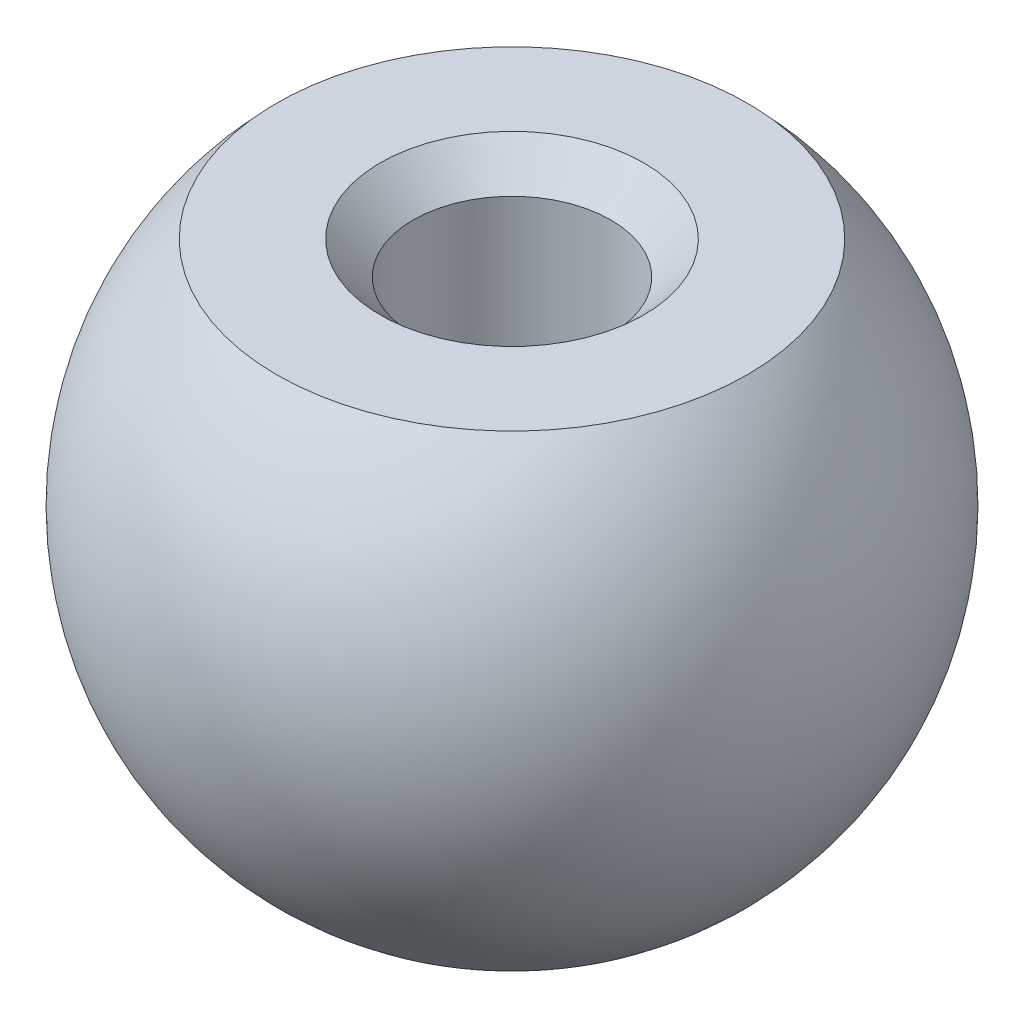
ISO-10303-21;
HEADER;
FILE_DESCRIPTION(('STEP AP214'),'2;1');
FILE_NAME('part.step','',(''),(''),'','','');
FILE_SCHEMA(('AUTOMOTIVE_DESIGN { 1 0 10303 214 1 1 1 1 }'));
ENDSEC;
DATA;
#1=APPLICATION_CONTEXT('core data for automotive mechanical design processes');
#2=APPLICATION_PROTOCOL_DEFINITION('international standard','automotive_design',2000,#1);
#3=PRODUCT_CONTEXT('',#1,'mechanical');
#4=PRODUCT('Part','Part','',(#3));
#5=PRODUCT_RELATED_PRODUCT_CATEGORY('part','',(#4));
#6=PRODUCT_DEFINITION_FORMATION('','',#4);
#7=PRODUCT_DEFINITION_CONTEXT('part definition',#1,'design');
#8=PRODUCT_DEFINITION('design','',#6,#7);
#9=PRODUCT_DEFINITION_SHAPE('','',#8);
#10=(LENGTH_UNIT() NAMED_UNIT(*) SI_UNIT(.MILLI.,.METRE.));
#11=(NAMED_UNIT(*) PLANE_ANGLE_UNIT() SI_UNIT($,.RADIAN.));
#12=(NAMED_UNIT(*) SI_UNIT($,.STERADIAN.) SOLID_ANGLE_UNIT());
#13=UNCERTAINTY_MEASURE_WITH_UNIT(LENGTH_MEASURE(1.E-05),#10,'distance_accuracy_value','');
#14=(GEOMETRIC_REPRESENTATION_CONTEXT(3) GLOBAL_UNCERTAINTY_ASSIGNED_CONTEXT((#13)) GLOBAL_UNIT_ASSIGNED_CONTEXT((#10,
#11,#12)) REPRESENTATION_CONTEXT('',''));
#15=CARTESIAN_POINT('',(0.,0.,0.));
#16=DIRECTION('',(0.,0.,1.));
#17=DIRECTION('',(1.,0.,0.));
#18=AXIS2_PLACEMENT_3D('',#15,#16,#17);
#19=CARTESIAN_POINT('',(0.,0.,0.));
#20=DIRECTION('',(0.,1.,0.));
#21=DIRECTION('',(1.,0.,0.));
#22=AXIS2_PLACEMENT_3D('',#19,#20,#21);
#23=SPHERICAL_SURFACE('',#22,5.);
#24=CARTESIAN_POINT('',(0.,3.5,0.));
#25=DIRECTION('',(0.,1.,0.));
#26=DIRECTION('',(0.,0.,1.));
#27=AXIS2_PLACEMENT_3D('',#24,#25,#26);
#28=CIRCLE('',#27,3.57071421427142);
#29=CARTESIAN_POINT('',(0.,3.5,3.57071421427142));
#30=VERTEX_POINT('',#29);
#31=EDGE_CURVE('E42',#30,#30,#28,.T.);
#32=ORIENTED_EDGE('',*,*,#31,.F.);
#33=EDGE_LOOP('',(#32));
#34=FACE_BOUND('',#33,.T.);
#35=ADVANCED_FACE('F31',(#34),#23,.T.);
#36=CARTESIAN_POINT('',(0.,3.5,0.));
#37=DIRECTION('',(0.,-1.,0.));
#38=DIRECTION('',(0.,0.,-1.));
#39=AXIS2_PLACEMENT_3D('',#36,#37,#38);
#40=PLANE('',#39);
#41=CARTESIAN_POINT('',(0.,3.5,0.));
#42=DIRECTION('',(0.,-1.,0.));
#43=DIRECTION('',(0.,0.,-1.));
#44=AXIS2_PLACEMENT_3D('',#41,#42,#43);
#45=CIRCLE('',#44,2.);
#46=CARTESIAN_POINT('',(0.,3.5,-2.));
#47=VERTEX_POINT('',#46);
#48=EDGE_CURVE('E10',#47,#47,#45,.T.);
#49=ORIENTED_EDGE('',*,*,#48,.T.);
#50=EDGE_LOOP('',(#49));
#51=FACE_BOUND('',#50,.T.);
#52=ORIENTED_EDGE('',*,*,#31,.T.);
#53=EDGE_LOOP('',(#52));
#54=FACE_BOUND('',#53,.T.);
#55=ADVANCED_FACE('F56',(#51,#54),#40,.F.);
#56=CARTESIAN_POINT('',(0.,-2.5,0.));
#57=DIRECTION('',(0.,1.,0.));
#58=DIRECTION('',(0.,0.,1.));
#59=AXIS2_PLACEMENT_3D('',#56,#57,#58);
#60=CYLINDRICAL_SURFACE('',#59,1.5);
#61=CARTESIAN_POINT('',(0.,3.,0.));
#62=DIRECTION('',(0.,-1.,0.));
#63=DIRECTION('',(0.,0.,-1.));
#64=AXIS2_PLACEMENT_3D('',#61,#62,#63);
#65=CIRCLE('',#64,1.5);
#66=CARTESIAN_POINT('',(0.,3.,-1.5));
#67=VERTEX_POINT('',#66);
#68=EDGE_CURVE('E38',#67,#67,#65,.F.);
#69=ORIENTED_EDGE('',*,*,#68,.T.);
#70=EDGE_LOOP('',(#69));
#71=FACE_BOUND('',#70,.T.);
#72=CARTESIAN_POINT('',(0.,-2.5,0.));
#73=DIRECTION('',(0.,1.,0.));
#74=DIRECTION('',(0.,0.,1.));
#75=AXIS2_PLACEMENT_3D('',#72,#73,#74);
#76=CIRCLE('',#75,1.5);
#77=CARTESIAN_POINT('',(0.,-2.5,1.5));
#78=VERTEX_POINT('',#77);
#79=EDGE_CURVE('E46',#78,#78,#76,.T.);
#80=ORIENTED_EDGE('',*,*,#79,.F.);
#81=EDGE_LOOP('',(#80));
#82=FACE_BOUND('',#81,.T.);
#83=ADVANCED_FACE('F54',(#71,#82),#60,.F.);
#84=CARTESIAN_POINT('',(0.,-2.5,0.));
#85=DIRECTION('',(0.,1.,0.));
#86=DIRECTION('',(0.,0.,1.));
#87=AXIS2_PLACEMENT_3D('',#84,#85,#86);
#88=PLANE('',#87);
#89=ORIENTED_EDGE('',*,*,#79,.T.);
#90=EDGE_LOOP('',(#89));
#91=FACE_BOUND('',#90,.T.);
#92=ADVANCED_FACE('F52',(#91),#88,.T.);
#93=CARTESIAN_POINT('',(0.,3.,0.));
#94=DIRECTION('',(0.,1.,0.));
#95=DIRECTION('',(0.,0.,1.));
#96=AXIS2_PLACEMENT_3D('',#93,#94,#95);
#97=CONICAL_SURFACE('',#96,1.5,0.785398163397449);
#98=ORIENTED_EDGE('',*,*,#48,.F.);
#99=EDGE_LOOP('',(#98));
#100=FACE_BOUND('',#99,.T.);
#101=ORIENTED_EDGE('',*,*,#68,.F.);
#102=EDGE_LOOP('',(#101));
#103=FACE_BOUND('',#102,.T.);
#104=ADVANCED_FACE('F33',(#100,#103),#97,.F.);
#105=CLOSED_SHELL('',(#35,#55,#83,#92,#104));
#106=MANIFOLD_SOLID_BREP('B2',#105);
#107=ADVANCED_BREP_SHAPE_REPRESENTATION('',(#18,#106),#14);
#108=SHAPE_DEFINITION_REPRESENTATION(#9,#107);
ENDSEC;
END-ISO-10303-21;
